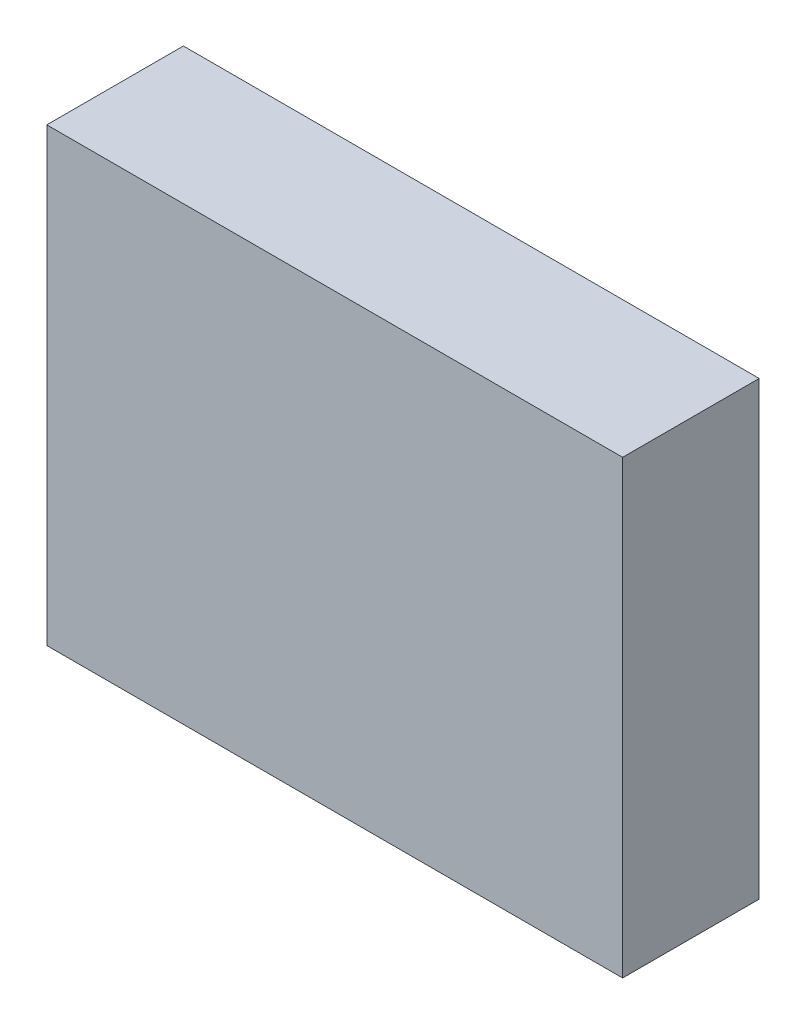
ISO-10303-21;
HEADER;
FILE_DESCRIPTION(('STEP AP214'),'2;1');
FILE_NAME('part.step','',(''),(''),'','','');
FILE_SCHEMA(('AUTOMOTIVE_DESIGN { 1 0 10303 214 1 1 1 1 }'));
ENDSEC;
DATA;
#1=APPLICATION_CONTEXT('core data for automotive mechanical design processes');
#2=APPLICATION_PROTOCOL_DEFINITION('international standard','automotive_design',2000,#1);
#3=PRODUCT_CONTEXT('',#1,'mechanical');
#4=PRODUCT('Part','Part','',(#3));
#5=PRODUCT_RELATED_PRODUCT_CATEGORY('part','',(#4));
#6=PRODUCT_DEFINITION_FORMATION('','',#4);
#7=PRODUCT_DEFINITION_CONTEXT('part definition',#1,'design');
#8=PRODUCT_DEFINITION('design','',#6,#7);
#9=PRODUCT_DEFINITION_SHAPE('','',#8);
#10=(LENGTH_UNIT() NAMED_UNIT(*) SI_UNIT(.MILLI.,.METRE.));
#11=(NAMED_UNIT(*) PLANE_ANGLE_UNIT() SI_UNIT($,.RADIAN.));
#12=(NAMED_UNIT(*) SI_UNIT($,.STERADIAN.) SOLID_ANGLE_UNIT());
#13=UNCERTAINTY_MEASURE_WITH_UNIT(LENGTH_MEASURE(1.E-05),#10,'distance_accuracy_value','');
#14=(GEOMETRIC_REPRESENTATION_CONTEXT(3) GLOBAL_UNCERTAINTY_ASSIGNED_CONTEXT((#13)) GLOBAL_UNIT_ASSIGNED_CONTEXT((#10,
#11,#12)) REPRESENTATION_CONTEXT('',''));
#15=CARTESIAN_POINT('',(0.,0.,0.));
#16=DIRECTION('',(0.,0.,1.));
#17=DIRECTION('',(1.,0.,0.));
#18=AXIS2_PLACEMENT_3D('',#15,#16,#17);
#19=CARTESIAN_POINT('',(-2.1082,1.651,1.00000054));
#20=DIRECTION('',(0.,0.,-1.));
#21=DIRECTION('',(-1.,0.,0.));
#22=AXIS2_PLACEMENT_3D('',#19,#20,#21);
#23=PLANE('',#22);
#24=DIRECTION('',(1.,0.,0.));
#25=VECTOR('',#24,1.);
#26=CARTESIAN_POINT('',(-2.1082,-1.651,1.00000054));
#27=LINE('',#26,#25);
#28=CARTESIAN_POINT('',(-2.1082,-1.651,1.00000054));
#29=VERTEX_POINT('',#28);
#30=CARTESIAN_POINT('',(2.1082,-1.651,1.00000054));
#31=VERTEX_POINT('',#30);
#32=EDGE_CURVE('E55',#29,#31,#27,.T.);
#33=ORIENTED_EDGE('',*,*,#32,.T.);
#34=DIRECTION('',(0.,1.,0.));
#35=VECTOR('',#34,1.);
#36=CARTESIAN_POINT('',(2.1082,-1.651,1.00000054));
#37=LINE('',#36,#35);
#38=CARTESIAN_POINT('',(2.1082,1.651,1.00000054));
#39=VERTEX_POINT('',#38);
#40=EDGE_CURVE('E57',#31,#39,#37,.T.);
#41=ORIENTED_EDGE('',*,*,#40,.T.);
#42=DIRECTION('',(1.,0.,0.));
#43=VECTOR('',#42,1.);
#44=CARTESIAN_POINT('',(2.1082,1.651,1.00000054));
#45=LINE('',#44,#43);
#46=CARTESIAN_POINT('',(-2.1082,1.651,1.00000054));
#47=VERTEX_POINT('',#46);
#48=EDGE_CURVE('E20',#39,#47,#45,.F.);
#49=ORIENTED_EDGE('',*,*,#48,.T.);
#50=DIRECTION('',(0.,1.,0.));
#51=VECTOR('',#50,1.);
#52=CARTESIAN_POINT('',(-2.1082,1.651,1.00000054));
#53=LINE('',#52,#51);
#54=EDGE_CURVE('E80',#47,#29,#53,.F.);
#55=ORIENTED_EDGE('',*,*,#54,.T.);
#56=EDGE_LOOP('',(#33,#41,#49,#55));
#57=FACE_BOUND('',#56,.T.);
#58=ADVANCED_FACE('F17',(#57),#23,.F.);
#59=CARTESIAN_POINT('',(2.1082,1.651,0.));
#60=DIRECTION('',(0.,-1.,0.));
#61=DIRECTION('',(0.,0.,-1.));
#62=AXIS2_PLACEMENT_3D('',#59,#60,#61);
#63=PLANE('',#62);
#64=DIRECTION('',(0.,0.,-1.));
#65=VECTOR('',#64,1.);
#66=CARTESIAN_POINT('',(-2.1082,1.651,0.));
#67=LINE('',#66,#65);
#68=CARTESIAN_POINT('',(-2.1082,1.651,0.));
#69=VERTEX_POINT('',#68);
#70=EDGE_CURVE('E68',#69,#47,#67,.F.);
#71=ORIENTED_EDGE('',*,*,#70,.T.);
#72=ORIENTED_EDGE('',*,*,#48,.F.);
#73=DIRECTION('',(0.,0.,1.));
#74=VECTOR('',#73,1.);
#75=CARTESIAN_POINT('',(2.1082,1.651,0.));
#76=LINE('',#75,#74);
#77=CARTESIAN_POINT('',(2.1082,1.651,0.));
#78=VERTEX_POINT('',#77);
#79=EDGE_CURVE('E63',#39,#78,#76,.F.);
#80=ORIENTED_EDGE('',*,*,#79,.T.);
#81=DIRECTION('',(-1.,0.,0.));
#82=VECTOR('',#81,1.);
#83=CARTESIAN_POINT('',(-2.1082,1.651,0.));
#84=LINE('',#83,#82);
#85=EDGE_CURVE('E83',#69,#78,#84,.F.);
#86=ORIENTED_EDGE('',*,*,#85,.F.);
#87=EDGE_LOOP('',(#71,#72,#80,#86));
#88=FACE_BOUND('',#87,.T.);
#89=ADVANCED_FACE('F65',(#88),#63,.F.);
#90=CARTESIAN_POINT('',(2.1082,-1.651,0.));
#91=DIRECTION('',(-1.,0.,0.));
#92=DIRECTION('',(0.,0.,1.));
#93=AXIS2_PLACEMENT_3D('',#90,#91,#92);
#94=PLANE('',#93);
#95=ORIENTED_EDGE('',*,*,#79,.F.);
#96=ORIENTED_EDGE('',*,*,#40,.F.);
#97=DIRECTION('',(0.,0.,1.));
#98=VECTOR('',#97,1.);
#99=CARTESIAN_POINT('',(2.1082,-1.651,0.));
#100=LINE('',#99,#98);
#101=CARTESIAN_POINT('',(2.1082,-1.651,0.));
#102=VERTEX_POINT('',#101);
#103=EDGE_CURVE('E75',#31,#102,#100,.F.);
#104=ORIENTED_EDGE('',*,*,#103,.T.);
#105=DIRECTION('',(0.,1.,0.));
#106=VECTOR('',#105,1.);
#107=CARTESIAN_POINT('',(2.1082,1.651,0.));
#108=LINE('',#107,#106);
#109=EDGE_CURVE('E72',#78,#102,#108,.F.);
#110=ORIENTED_EDGE('',*,*,#109,.F.);
#111=EDGE_LOOP('',(#95,#96,#104,#110));
#112=FACE_BOUND('',#111,.T.);
#113=ADVANCED_FACE('F70',(#112),#94,.F.);
#114=CARTESIAN_POINT('',(-2.1082,-1.651,0.));
#115=DIRECTION('',(0.,1.,0.));
#116=DIRECTION('',(0.,0.,1.));
#117=AXIS2_PLACEMENT_3D('',#114,#115,#116);
#118=PLANE('',#117);
#119=ORIENTED_EDGE('',*,*,#103,.F.);
#120=ORIENTED_EDGE('',*,*,#32,.F.);
#121=DIRECTION('',(0.,0.,-1.));
#122=VECTOR('',#121,1.);
#123=CARTESIAN_POINT('',(-2.1082,-1.651,0.));
#124=LINE('',#123,#122);
#125=CARTESIAN_POINT('',(-2.1082,-1.651,0.));
#126=VERTEX_POINT('',#125);
#127=EDGE_CURVE('E35',#29,#126,#124,.T.);
#128=ORIENTED_EDGE('',*,*,#127,.T.);
#129=DIRECTION('',(-1.,0.,0.));
#130=VECTOR('',#129,1.);
#131=CARTESIAN_POINT('',(-2.1082,-1.651,0.));
#132=LINE('',#131,#130);
#133=EDGE_CURVE('E26',#102,#126,#132,.T.);
#134=ORIENTED_EDGE('',*,*,#133,.F.);
#135=EDGE_LOOP('',(#119,#120,#128,#134));
#136=FACE_BOUND('',#135,.T.);
#137=ADVANCED_FACE('F89',(#136),#118,.F.);
#138=CARTESIAN_POINT('',(-2.1082,1.651,0.));
#139=DIRECTION('',(1.,0.,0.));
#140=DIRECTION('',(0.,0.,-1.));
#141=AXIS2_PLACEMENT_3D('',#138,#139,#140);
#142=PLANE('',#141);
#143=ORIENTED_EDGE('',*,*,#127,.F.);
#144=ORIENTED_EDGE('',*,*,#54,.F.);
#145=ORIENTED_EDGE('',*,*,#70,.F.);
#146=DIRECTION('',(0.,1.,0.));
#147=VECTOR('',#146,1.);
#148=CARTESIAN_POINT('',(-2.1082,1.651,0.));
#149=LINE('',#148,#147);
#150=EDGE_CURVE('E11',#126,#69,#149,.T.);
#151=ORIENTED_EDGE('',*,*,#150,.F.);
#152=EDGE_LOOP('',(#143,#144,#145,#151));
#153=FACE_BOUND('',#152,.T.);
#154=ADVANCED_FACE('F91',(#153),#142,.F.);
#155=CARTESIAN_POINT('',(-2.1082,1.651,0.));
#156=DIRECTION('',(0.,0.,-1.));
#157=DIRECTION('',(-1.,0.,0.));
#158=AXIS2_PLACEMENT_3D('',#155,#156,#157);
#159=PLANE('',#158);
#160=ORIENTED_EDGE('',*,*,#133,.T.);
#161=ORIENTED_EDGE('',*,*,#150,.T.);
#162=ORIENTED_EDGE('',*,*,#85,.T.);
#163=ORIENTED_EDGE('',*,*,#109,.T.);
#164=EDGE_LOOP('',(#160,#161,#162,#163));
#165=FACE_BOUND('',#164,.T.);
#166=ADVANCED_FACE('F88',(#165),#159,.T.);
#167=CLOSED_SHELL('',(#58,#89,#113,#137,#154,#166));
#168=MANIFOLD_SOLID_BREP('B1',#167);
#169=ADVANCED_BREP_SHAPE_REPRESENTATION('',(#18,#168),#14);
#170=SHAPE_DEFINITION_REPRESENTATION(#9,#169);
ENDSEC;
END-ISO-10303-21;
